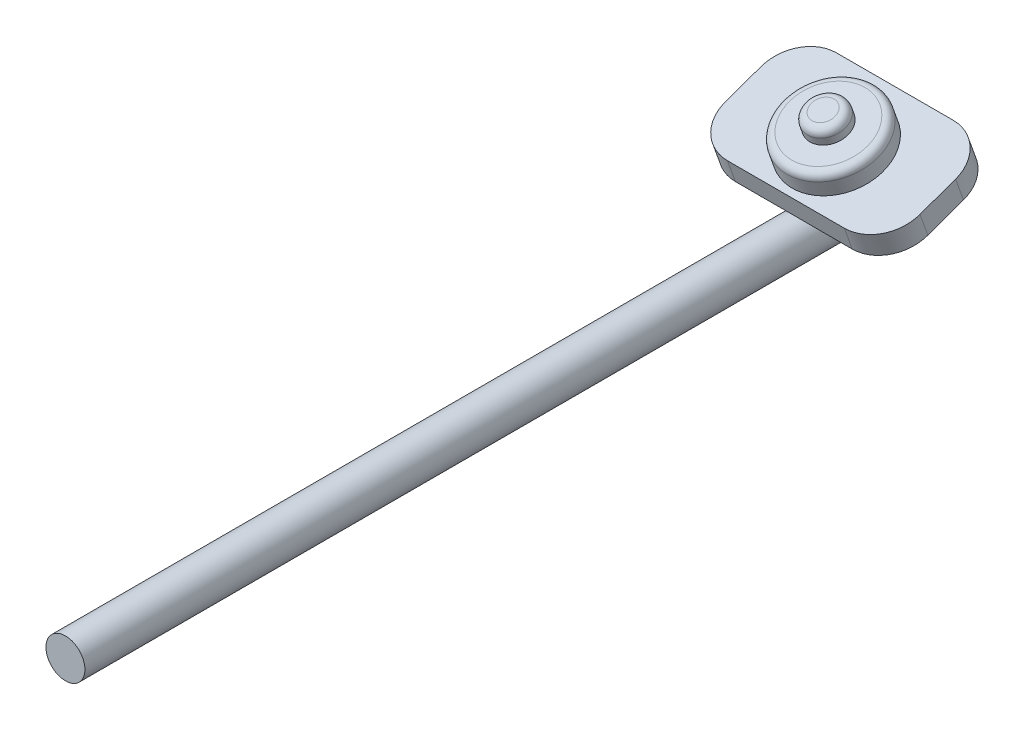
ISO-10303-21;
HEADER;
FILE_DESCRIPTION(('STEP AP214'),'2;1');
FILE_NAME('part.step','',(''),(''),'','','');
FILE_SCHEMA(('AUTOMOTIVE_DESIGN { 1 0 10303 214 1 1 1 1 }'));
ENDSEC;
DATA;
#1=APPLICATION_CONTEXT('core data for automotive mechanical design processes');
#2=APPLICATION_PROTOCOL_DEFINITION('international standard','automotive_design',2000,#1);
#3=PRODUCT_CONTEXT('',#1,'mechanical');
#4=PRODUCT('Part','Part','',(#3));
#5=PRODUCT_RELATED_PRODUCT_CATEGORY('part','',(#4));
#6=PRODUCT_DEFINITION_FORMATION('','',#4);
#7=PRODUCT_DEFINITION_CONTEXT('part definition',#1,'design');
#8=PRODUCT_DEFINITION('design','',#6,#7);
#9=PRODUCT_DEFINITION_SHAPE('','',#8);
#10=(LENGTH_UNIT() NAMED_UNIT(*) SI_UNIT(.MILLI.,.METRE.));
#11=(NAMED_UNIT(*) PLANE_ANGLE_UNIT() SI_UNIT($,.RADIAN.));
#12=(NAMED_UNIT(*) SI_UNIT($,.STERADIAN.) SOLID_ANGLE_UNIT());
#13=UNCERTAINTY_MEASURE_WITH_UNIT(LENGTH_MEASURE(1.E-05),#10,'distance_accuracy_value','');
#14=(GEOMETRIC_REPRESENTATION_CONTEXT(3) GLOBAL_UNCERTAINTY_ASSIGNED_CONTEXT((#13)) GLOBAL_UNIT_ASSIGNED_CONTEXT((#10,
#11,#12)) REPRESENTATION_CONTEXT('',''));
#15=CARTESIAN_POINT('',(0.,0.,0.));
#16=DIRECTION('',(0.,0.,1.));
#17=DIRECTION('',(1.,0.,0.));
#18=AXIS2_PLACEMENT_3D('',#15,#16,#17);
#19=CARTESIAN_POINT('',(0.,0.,100.));
#20=DIRECTION('',(0.,0.,-1.));
#21=DIRECTION('',(-1.,0.,0.));
#22=AXIS2_PLACEMENT_3D('',#19,#20,#21);
#23=CYLINDRICAL_SURFACE('',#22,2.5);
#24=CARTESIAN_POINT('',(0.,0.,100.));
#25=DIRECTION('',(0.,0.,1.));
#26=DIRECTION('',(1.,0.,0.));
#27=AXIS2_PLACEMENT_3D('',#24,#25,#26);
#28=CIRCLE('',#27,2.5);
#29=CARTESIAN_POINT('',(2.5,0.,100.));
#30=VERTEX_POINT('',#29);
#31=EDGE_CURVE('E11',#30,#30,#28,.T.);
#32=ORIENTED_EDGE('',*,*,#31,.F.);
#33=EDGE_LOOP('',(#32));
#34=FACE_BOUND('',#33,.T.);
#35=CARTESIAN_POINT('',(0.,0.,0.));
#36=DIRECTION('',(0.,0.,1.));
#37=DIRECTION('',(1.,0.,0.));
#38=AXIS2_PLACEMENT_3D('',#35,#36,#37);
#39=CIRCLE('',#38,2.5);
#40=CARTESIAN_POINT('',(2.5,0.,0.));
#41=VERTEX_POINT('',#40);
#42=EDGE_CURVE('E61',#41,#41,#39,.T.);
#43=ORIENTED_EDGE('',*,*,#42,.T.);
#44=EDGE_LOOP('',(#43));
#45=FACE_BOUND('',#44,.T.);
#46=ADVANCED_FACE('F53',(#34,#45),#23,.T.);
#47=CARTESIAN_POINT('',(0.,0.,100.));
#48=DIRECTION('',(0.,0.,1.));
#49=DIRECTION('',(1.,0.,0.));
#50=AXIS2_PLACEMENT_3D('',#47,#48,#49);
#51=PLANE('',#50);
#52=ORIENTED_EDGE('',*,*,#31,.T.);
#53=EDGE_LOOP('',(#52));
#54=FACE_BOUND('',#53,.T.);
#55=ADVANCED_FACE('F55',(#54),#51,.T.);
#56=CARTESIAN_POINT('',(0.,0.,0.));
#57=DIRECTION('',(0.,0.,1.));
#58=DIRECTION('',(1.,0.,0.));
#59=AXIS2_PLACEMENT_3D('',#56,#57,#58);
#60=PLANE('',#59);
#61=ORIENTED_EDGE('',*,*,#42,.F.);
#62=EDGE_LOOP('',(#61));
#63=FACE_BOUND('',#62,.T.);
#64=ADVANCED_FACE('F69',(#63),#60,.F.);
#65=CLOSED_SHELL('',(#46,#55,#64));
#66=MANIFOLD_SOLID_BREP('B2',#65);
#67=CARTESIAN_POINT('',(12.5,7.09872421921121,2.53700279345642));
#68=DIRECTION('',(0.,-0.941668605803775,-0.33654158263664));
#69=DIRECTION('',(0.,0.33654158263664,-0.941668605803775));
#70=AXIS2_PLACEMENT_3D('',#67,#68,#69);
#71=PLANE('',#70);
#72=CARTESIAN_POINT('',(0.,7.63267315631821,1.04297359434012));
#73=DIRECTION('',(0.,-0.941668605803775,-0.33654158263664));
#74=DIRECTION('',(0.,0.33654158263664,-0.941668605803775));
#75=AXIS2_PLACEMENT_3D('',#72,#73,#74);
#76=CIRCLE('',#75,6.);
#77=CARTESIAN_POINT('',(0.,9.65192265213805,-4.60703804048253));
#78=VERTEX_POINT('',#77);
#79=EDGE_CURVE('E204',#78,#78,#76,.F.);
#80=ORIENTED_EDGE('',*,*,#79,.F.);
#81=EDGE_LOOP('',(#80));
#82=FACE_BOUND('',#81,.T.);
#83=DIRECTION('',(0.,-0.33654158263664,0.941668605803775));
#84=VECTOR('',#83,1.);
#85=CARTESIAN_POINT('',(12.5,7.09872421921121,2.53700279345642));
#86=LINE('',#85,#84);
#87=CARTESIAN_POINT('',(12.5,8.64229790422812,-1.7820322230712));
#88=VERTEX_POINT('',#87);
#89=CARTESIAN_POINT('',(12.5,7.00771373059453,2.79165697098112));
#90=VERTEX_POINT('',#89);
#91=EDGE_CURVE('E309',#88,#90,#86,.T.);
#92=ORIENTED_EDGE('',*,*,#91,.F.);
#93=CARTESIAN_POINT('',(7.5,8.64229790422812,-1.7820322230712));
#94=DIRECTION('',(0.,-0.941668605803775,-0.33654158263664));
#95=DIRECTION('',(0.,0.33654158263664,-0.941668605803775));
#96=AXIS2_PLACEMENT_3D('',#93,#94,#95);
#97=CIRCLE('',#96,5.);
#98=CARTESIAN_POINT('',(7.5,10.3250058174113,-6.49037525209008));
#99=VERTEX_POINT('',#98);
#100=EDGE_CURVE('E199',#88,#99,#97,.F.);
#101=ORIENTED_EDGE('',*,*,#100,.T.);
#102=DIRECTION('',(-1.,0.,0.));
#103=VECTOR('',#102,1.);
#104=CARTESIAN_POINT('',(12.5,10.3250058174113,-6.49037525209008));
#105=LINE('',#104,#103);
#106=CARTESIAN_POINT('',(-7.5,10.3250058174113,-6.49037525209008));
#107=VERTEX_POINT('',#106);
#108=EDGE_CURVE('E295',#99,#107,#105,.T.);
#109=ORIENTED_EDGE('',*,*,#108,.T.);
#110=CARTESIAN_POINT('',(-7.5,8.64229790422812,-1.7820322230712));
#111=DIRECTION('',(0.,-0.941668605803775,-0.33654158263664));
#112=DIRECTION('',(0.,0.33654158263664,-0.941668605803775));
#113=AXIS2_PLACEMENT_3D('',#110,#111,#112);
#114=CIRCLE('',#113,5.);
#115=CARTESIAN_POINT('',(-12.5,8.64229790422812,-1.78203222307121));
#116=VERTEX_POINT('',#115);
#117=EDGE_CURVE('E202',#107,#116,#114,.F.);
#118=ORIENTED_EDGE('',*,*,#117,.T.);
#119=DIRECTION('',(0.,-0.33654158263664,0.941668605803775));
#120=VECTOR('',#119,1.);
#121=CARTESIAN_POINT('',(-12.5,7.09872421921121,2.53700279345642));
#122=LINE('',#121,#120);
#123=CARTESIAN_POINT('',(-12.5,7.00771373059453,2.79165697098112));
#124=VERTEX_POINT('',#123);
#125=EDGE_CURVE('E195',#116,#124,#122,.T.);
#126=ORIENTED_EDGE('',*,*,#125,.T.);
#127=CARTESIAN_POINT('',(-7.5,7.00771373059453,2.79165697098112));
#128=DIRECTION('',(0.,-0.941668605803775,-0.33654158263664));
#129=DIRECTION('',(0.,0.33654158263664,-0.941668605803775));
#130=AXIS2_PLACEMENT_3D('',#127,#128,#129);
#131=CIRCLE('',#130,5.);
#132=CARTESIAN_POINT('',(-7.5,5.32500581741133,7.5));
#133=VERTEX_POINT('',#132);
#134=EDGE_CURVE('E200',#124,#133,#131,.F.);
#135=ORIENTED_EDGE('',*,*,#134,.T.);
#136=DIRECTION('',(-1.,0.,0.));
#137=VECTOR('',#136,1.);
#138=CARTESIAN_POINT('',(12.5,5.32500581741133,7.5));
#139=LINE('',#138,#137);
#140=CARTESIAN_POINT('',(7.5,5.32500581741133,7.5));
#141=VERTEX_POINT('',#140);
#142=EDGE_CURVE('E290',#141,#133,#139,.T.);
#143=ORIENTED_EDGE('',*,*,#142,.F.);
#144=CARTESIAN_POINT('',(7.5,7.00771373059452,2.79165697098112));
#145=DIRECTION('',(0.,-0.941668605803775,-0.33654158263664));
#146=DIRECTION('',(0.,0.33654158263664,-0.941668605803775));
#147=AXIS2_PLACEMENT_3D('',#144,#145,#146);
#148=CIRCLE('',#147,5.);
#149=EDGE_CURVE('E209',#141,#90,#148,.F.);
#150=ORIENTED_EDGE('',*,*,#149,.T.);
#151=EDGE_LOOP('',(#92,#101,#109,#118,#126,#135,#143,#150));
#152=FACE_BOUND('',#151,.T.);
#153=ADVANCED_FACE('F108',(#82,#152),#71,.F.);
#154=CARTESIAN_POINT('',(12.5,-1.77371840179989,4.96299720654358));
#155=DIRECTION('',(0.,0.33654158263664,-0.941668605803775));
#156=DIRECTION('',(0.,0.941668605803775,0.33654158263664));
#157=AXIS2_PLACEMENT_3D('',#154,#155,#156);
#158=PLANE('',#157);
#159=DIRECTION('',(-1.,0.,0.));
#160=VECTOR('',#159,1.);
#161=CARTESIAN_POINT('',(12.5,2.5,6.49037525209007));
#162=LINE('',#161,#160);
#163=CARTESIAN_POINT('',(7.5,2.5,6.49037525209007));
#164=VERTEX_POINT('',#163);
#165=CARTESIAN_POINT('',(-7.5,2.5,6.49037525209007));
#166=VERTEX_POINT('',#165);
#167=EDGE_CURVE('E294',#164,#166,#162,.T.);
#168=ORIENTED_EDGE('',*,*,#167,.F.);
#169=DIRECTION('',(0.,-0.941668605803775,-0.33654158263664));
#170=VECTOR('',#169,1.);
#171=CARTESIAN_POINT('',(7.5,-1.77371840179989,4.96299720654358));
#172=LINE('',#171,#170);
#173=EDGE_CURVE('E223',#164,#141,#172,.F.);
#174=ORIENTED_EDGE('',*,*,#173,.T.);
#175=ORIENTED_EDGE('',*,*,#142,.T.);
#176=DIRECTION('',(0.,-0.941668605803775,-0.33654158263664));
#177=VECTOR('',#176,1.);
#178=CARTESIAN_POINT('',(-7.5,-1.77371840179989,4.96299720654358));
#179=LINE('',#178,#177);
#180=EDGE_CURVE('E183',#133,#166,#179,.T.);
#181=ORIENTED_EDGE('',*,*,#180,.T.);
#182=EDGE_LOOP('',(#168,#174,#175,#181));
#183=FACE_BOUND('',#182,.T.);
#184=ADVANCED_FACE('F248',(#183),#158,.F.);
#185=CARTESIAN_POINT('',(12.5,3.22628159820011,-9.0273780455465));
#186=DIRECTION('',(0.,-0.33654158263664,0.941668605803775));
#187=DIRECTION('',(0.,-0.941668605803775,-0.33654158263664));
#188=AXIS2_PLACEMENT_3D('',#185,#186,#187);
#189=PLANE('',#188);
#190=ORIENTED_EDGE('',*,*,#108,.F.);
#191=DIRECTION('',(0.,0.941668605803775,0.33654158263664));
#192=VECTOR('',#191,1.);
#193=CARTESIAN_POINT('',(7.5,3.22628159820011,-9.0273780455465));
#194=LINE('',#193,#192);
#195=CARTESIAN_POINT('',(7.5,7.5,-7.5));
#196=VERTEX_POINT('',#195);
#197=EDGE_CURVE('E215',#99,#196,#194,.F.);
#198=ORIENTED_EDGE('',*,*,#197,.T.);
#199=DIRECTION('',(-1.,0.,0.));
#200=VECTOR('',#199,1.);
#201=CARTESIAN_POINT('',(12.5,7.5,-7.5));
#202=LINE('',#201,#200);
#203=CARTESIAN_POINT('',(-7.5,7.5,-7.5));
#204=VERTEX_POINT('',#203);
#205=EDGE_CURVE('E179',#196,#204,#202,.T.);
#206=ORIENTED_EDGE('',*,*,#205,.T.);
#207=DIRECTION('',(0.,0.941668605803775,0.33654158263664));
#208=VECTOR('',#207,1.);
#209=CARTESIAN_POINT('',(-7.5,3.22628159820011,-9.0273780455465));
#210=LINE('',#209,#208);
#211=EDGE_CURVE('E212',#204,#107,#210,.T.);
#212=ORIENTED_EDGE('',*,*,#211,.T.);
#213=EDGE_LOOP('',(#190,#198,#206,#212));
#214=FACE_BOUND('',#213,.T.);
#215=ADVANCED_FACE('F254',(#214),#189,.F.);
#216=CARTESIAN_POINT('',(12.5,15.,7.5));
#217=DIRECTION('',(-1.,0.,0.));
#218=DIRECTION('',(0.,0.,1.));
#219=AXIS2_PLACEMENT_3D('',#216,#217,#218);
#220=PLANE('',#219);
#221=DIRECTION('',(0.,-0.33654158263664,0.941668605803775));
#222=VECTOR('',#221,1.);
#223=CARTESIAN_POINT('',(12.5,4.27371840179989,1.5273780455465));
#224=LINE('',#223,#222);
#225=CARTESIAN_POINT('',(12.5,5.8172920868168,-2.79165697098112));
#226=VERTEX_POINT('',#225);
#227=CARTESIAN_POINT('',(12.5,4.1827079131832,1.7820322230712));
#228=VERTEX_POINT('',#227);
#229=EDGE_CURVE('E177',#226,#228,#224,.T.);
#230=ORIENTED_EDGE('',*,*,#229,.F.);
#231=DIRECTION('',(0.,0.941668605803775,0.33654158263664));
#232=VECTOR('',#231,1.);
#233=CARTESIAN_POINT('',(12.5,17.2214999542366,1.2840764035458));
#234=LINE('',#233,#232);
#235=EDGE_CURVE('E191',#226,#88,#234,.T.);
#236=ORIENTED_EDGE('',*,*,#235,.T.);
#237=ORIENTED_EDGE('',*,*,#91,.T.);
#238=DIRECTION('',(0.,-0.941668605803775,-0.33654158263664));
#239=VECTOR('',#238,1.);
#240=CARTESIAN_POINT('',(12.5,15.586915780603,5.85776559759812));
#241=LINE('',#240,#239);
#242=EDGE_CURVE('E194',#90,#228,#241,.T.);
#243=ORIENTED_EDGE('',*,*,#242,.T.);
#244=EDGE_LOOP('',(#230,#236,#237,#243));
#245=FACE_BOUND('',#244,.T.);
#246=ADVANCED_FACE('F189',(#245),#220,.F.);
#247=CARTESIAN_POINT('',(-12.5,15.,7.5));
#248=DIRECTION('',(1.,0.,0.));
#249=DIRECTION('',(0.,0.,-1.));
#250=AXIS2_PLACEMENT_3D('',#247,#248,#249);
#251=PLANE('',#250);
#252=ORIENTED_EDGE('',*,*,#125,.F.);
#253=DIRECTION('',(0.,0.941668605803775,0.33654158263664));
#254=VECTOR('',#253,1.);
#255=CARTESIAN_POINT('',(-12.5,17.2214999542366,1.2840764035458));
#256=LINE('',#255,#254);
#257=CARTESIAN_POINT('',(-12.5,5.8172920868168,-2.79165697098112));
#258=VERTEX_POINT('',#257);
#259=EDGE_CURVE('E130',#116,#258,#256,.F.);
#260=ORIENTED_EDGE('',*,*,#259,.T.);
#261=DIRECTION('',(0.,-0.33654158263664,0.941668605803775));
#262=VECTOR('',#261,1.);
#263=CARTESIAN_POINT('',(-12.5,4.27371840179989,1.5273780455465));
#264=LINE('',#263,#262);
#265=CARTESIAN_POINT('',(-12.5,4.1827079131832,1.7820322230712));
#266=VERTEX_POINT('',#265);
#267=EDGE_CURVE('E196',#258,#266,#264,.T.);
#268=ORIENTED_EDGE('',*,*,#267,.T.);
#269=DIRECTION('',(0.,-0.941668605803775,-0.33654158263664));
#270=VECTOR('',#269,1.);
#271=CARTESIAN_POINT('',(-12.5,15.586915780603,5.85776559759812));
#272=LINE('',#271,#270);
#273=EDGE_CURVE('E225',#266,#124,#272,.F.);
#274=ORIENTED_EDGE('',*,*,#273,.T.);
#275=EDGE_LOOP('',(#252,#260,#268,#274));
#276=FACE_BOUND('',#275,.T.);
#277=ADVANCED_FACE('F267',(#276),#251,.F.);
#278=CARTESIAN_POINT('',(12.5,4.27371840179989,1.5273780455465));
#279=DIRECTION('',(0.,-0.941668605803775,-0.33654158263664));
#280=DIRECTION('',(0.,0.33654158263664,-0.941668605803775));
#281=AXIS2_PLACEMENT_3D('',#278,#279,#280);
#282=PLANE('',#281);
#283=ORIENTED_EDGE('',*,*,#205,.F.);
#284=CARTESIAN_POINT('',(7.5,5.8172920868168,-2.79165697098112));
#285=DIRECTION('',(0.,-0.941668605803775,-0.33654158263664));
#286=DIRECTION('',(0.,0.33654158263664,-0.941668605803775));
#287=AXIS2_PLACEMENT_3D('',#284,#285,#286);
#288=CIRCLE('',#287,5.);
#289=EDGE_CURVE('E174',#196,#226,#288,.T.);
#290=ORIENTED_EDGE('',*,*,#289,.T.);
#291=ORIENTED_EDGE('',*,*,#229,.T.);
#292=CARTESIAN_POINT('',(7.5,4.1827079131832,1.7820322230712));
#293=DIRECTION('',(0.,-0.941668605803775,-0.33654158263664));
#294=DIRECTION('',(0.,0.33654158263664,-0.941668605803775));
#295=AXIS2_PLACEMENT_3D('',#292,#293,#294);
#296=CIRCLE('',#295,5.);
#297=EDGE_CURVE('E184',#228,#164,#296,.T.);
#298=ORIENTED_EDGE('',*,*,#297,.T.);
#299=ORIENTED_EDGE('',*,*,#167,.T.);
#300=CARTESIAN_POINT('',(-7.5,4.1827079131832,1.7820322230712));
#301=DIRECTION('',(0.,-0.941668605803775,-0.33654158263664));
#302=DIRECTION('',(0.,0.33654158263664,-0.941668605803775));
#303=AXIS2_PLACEMENT_3D('',#300,#301,#302);
#304=CIRCLE('',#303,5.);
#305=EDGE_CURVE('E123',#166,#266,#304,.T.);
#306=ORIENTED_EDGE('',*,*,#305,.T.);
#307=ORIENTED_EDGE('',*,*,#267,.F.);
#308=CARTESIAN_POINT('',(-7.5,5.8172920868168,-2.79165697098112));
#309=DIRECTION('',(0.,-0.941668605803775,-0.33654158263664));
#310=DIRECTION('',(0.,0.33654158263664,-0.941668605803775));
#311=AXIS2_PLACEMENT_3D('',#308,#309,#310);
#312=CIRCLE('',#311,5.);
#313=EDGE_CURVE('E218',#258,#204,#312,.T.);
#314=ORIENTED_EDGE('',*,*,#313,.T.);
#315=EDGE_LOOP('',(#283,#290,#291,#298,#299,#306,#307,#314));
#316=FACE_BOUND('',#315,.T.);
#317=ADVANCED_FACE('F176',(#316),#282,.T.);
#318=CARTESIAN_POINT('',(0.,10.4576789737295,2.05259834225004));
#319=DIRECTION('',(0.,-0.941668605803775,-0.33654158263664));
#320=DIRECTION('',(0.,0.33654158263664,-0.941668605803775));
#321=AXIS2_PLACEMENT_3D('',#318,#319,#320);
#322=CYLINDRICAL_SURFACE('',#321,6.);
#323=CARTESIAN_POINT('',(0.,9.51601036792576,1.7160567596134));
#324=DIRECTION('',(0.,0.941668605803775,0.33654158263664));
#325=DIRECTION('',(0.,-0.33654158263664,0.941668605803775));
#326=AXIS2_PLACEMENT_3D('',#323,#324,#325);
#327=CIRCLE('',#326,6.);
#328=CARTESIAN_POINT('',(0.,7.49676087210592,7.36606839443605));
#329=VERTEX_POINT('',#328);
#330=EDGE_CURVE('E231',#329,#329,#327,.F.);
#331=ORIENTED_EDGE('',*,*,#330,.T.);
#332=EDGE_LOOP('',(#331));
#333=FACE_BOUND('',#332,.T.);
#334=ORIENTED_EDGE('',*,*,#79,.T.);
#335=EDGE_LOOP('',(#334));
#336=FACE_BOUND('',#335,.T.);
#337=ADVANCED_FACE('F325',(#333,#336),#322,.T.);
#338=CARTESIAN_POINT('',(0.,9.92373003662254,3.54662754136634));
#339=DIRECTION('',(0.,0.941668605803775,0.33654158263664));
#340=DIRECTION('',(0.,-0.33654158263664,0.941668605803775));
#341=AXIS2_PLACEMENT_3D('',#338,#339,#340);
#342=PLANE('',#341);
#343=CARTESIAN_POINT('',(0.,10.4576789737295,2.05259834225004));
#344=DIRECTION('',(0.,0.941668605803775,0.33654158263664));
#345=DIRECTION('',(0.,-0.33654158263664,0.941668605803775));
#346=AXIS2_PLACEMENT_3D('',#343,#344,#345);
#347=CIRCLE('',#346,5.);
#348=CARTESIAN_POINT('',(0.,8.77497106054634,6.76094137126892));
#349=VERTEX_POINT('',#348);
#350=EDGE_CURVE('E228',#349,#349,#347,.T.);
#351=ORIENTED_EDGE('',*,*,#350,.T.);
#352=EDGE_LOOP('',(#351));
#353=FACE_BOUND('',#352,.T.);
#354=CARTESIAN_POINT('',(0.,10.4576789737295,2.05259834225004));
#355=DIRECTION('',(0.,0.941668605803775,0.33654158263664));
#356=DIRECTION('',(0.,-0.33654158263664,0.941668605803775));
#357=AXIS2_PLACEMENT_3D('',#354,#355,#356);
#358=CIRCLE('',#357,2.5);
#359=CARTESIAN_POINT('',(0.,9.61632501713794,4.40676985675948));
#360=VERTEX_POINT('',#359);
#361=EDGE_CURVE('E303',#360,#360,#358,.F.);
#362=ORIENTED_EDGE('',*,*,#361,.T.);
#363=EDGE_LOOP('',(#362));
#364=FACE_BOUND('',#363,.T.);
#365=ADVANCED_FACE('F314',(#353,#364),#342,.T.);
#366=CARTESIAN_POINT('',(0.,12.3410161853371,2.72568150752332));
#367=DIRECTION('',(0.,-0.941668605803775,-0.33654158263664));
#368=DIRECTION('',(0.,0.33654158263664,-0.941668605803775));
#369=AXIS2_PLACEMENT_3D('',#366,#367,#368);
#370=CYLINDRICAL_SURFACE('',#369,2.5);
#371=CARTESIAN_POINT('',(0.,11.3993475795333,2.38913992488668));
#372=DIRECTION('',(0.,0.941668605803775,0.33654158263664));
#373=DIRECTION('',(0.,-0.33654158263664,0.941668605803775));
#374=AXIS2_PLACEMENT_3D('',#371,#372,#373);
#375=CIRCLE('',#374,2.5);
#376=CARTESIAN_POINT('',(0.,10.5579936229417,4.74331143939612));
#377=VERTEX_POINT('',#376);
#378=EDGE_CURVE('E51',#377,#377,#375,.F.);
#379=ORIENTED_EDGE('',*,*,#378,.T.);
#380=EDGE_LOOP('',(#379));
#381=FACE_BOUND('',#380,.T.);
#382=ORIENTED_EDGE('',*,*,#361,.F.);
#383=EDGE_LOOP('',(#382));
#384=FACE_BOUND('',#383,.T.);
#385=ADVANCED_FACE('F316',(#381,#384),#370,.T.);
#386=CARTESIAN_POINT('',(0.,11.8070672482301,4.21971070663962));
#387=DIRECTION('',(0.,0.941668605803775,0.33654158263664));
#388=DIRECTION('',(0.,-0.33654158263664,0.941668605803775));
#389=AXIS2_PLACEMENT_3D('',#386,#387,#388);
#390=PLANE('',#389);
#391=CARTESIAN_POINT('',(0.,12.3410161853371,2.72568150752332));
#392=DIRECTION('',(0.,0.941668605803775,0.33654158263664));
#393=DIRECTION('',(0.,-0.33654158263664,0.941668605803775));
#394=AXIS2_PLACEMENT_3D('',#391,#392,#393);
#395=CIRCLE('',#394,1.5);
#396=CARTESIAN_POINT('',(0.,11.8362038113821,4.13818441622898));
#397=VERTEX_POINT('',#396);
#398=EDGE_CURVE('E116',#397,#397,#395,.T.);
#399=ORIENTED_EDGE('',*,*,#398,.T.);
#400=EDGE_LOOP('',(#399));
#401=FACE_BOUND('',#400,.T.);
#402=ADVANCED_FACE('F236',(#401),#390,.T.);
#403=CARTESIAN_POINT('',(7.5,17.2214999542366,1.2840764035458));
#404=DIRECTION('',(0.,0.941668605803775,0.33654158263664));
#405=DIRECTION('',(0.,-0.33654158263664,0.941668605803775));
#406=AXIS2_PLACEMENT_3D('',#403,#404,#405);
#407=CYLINDRICAL_SURFACE('',#406,5.);
#408=ORIENTED_EDGE('',*,*,#289,.F.);
#409=ORIENTED_EDGE('',*,*,#197,.F.);
#410=ORIENTED_EDGE('',*,*,#100,.F.);
#411=ORIENTED_EDGE('',*,*,#235,.F.);
#412=EDGE_LOOP('',(#408,#409,#410,#411));
#413=FACE_BOUND('',#412,.T.);
#414=ADVANCED_FACE('F198',(#413),#407,.T.);
#415=CARTESIAN_POINT('',(7.5,15.586915780603,5.85776559759812));
#416=DIRECTION('',(0.,-0.941668605803775,-0.33654158263664));
#417=DIRECTION('',(0.,0.33654158263664,-0.941668605803775));
#418=AXIS2_PLACEMENT_3D('',#415,#416,#417);
#419=CYLINDRICAL_SURFACE('',#418,5.);
#420=ORIENTED_EDGE('',*,*,#149,.F.);
#421=ORIENTED_EDGE('',*,*,#173,.F.);
#422=ORIENTED_EDGE('',*,*,#297,.F.);
#423=ORIENTED_EDGE('',*,*,#242,.F.);
#424=EDGE_LOOP('',(#420,#421,#422,#423));
#425=FACE_BOUND('',#424,.T.);
#426=ADVANCED_FACE('F272',(#425),#419,.T.);
#427=CARTESIAN_POINT('',(-7.5,1.54357368501691,-4.31903501652762));
#428=DIRECTION('',(0.,0.941668605803775,0.33654158263664));
#429=DIRECTION('',(0.,-0.33654158263664,0.941668605803775));
#430=AXIS2_PLACEMENT_3D('',#427,#428,#429);
#431=CYLINDRICAL_SURFACE('',#430,5.);
#432=ORIENTED_EDGE('',*,*,#313,.F.);
#433=ORIENTED_EDGE('',*,*,#259,.F.);
#434=ORIENTED_EDGE('',*,*,#117,.F.);
#435=ORIENTED_EDGE('',*,*,#211,.F.);
#436=EDGE_LOOP('',(#432,#433,#434,#435));
#437=FACE_BOUND('',#436,.T.);
#438=ADVANCED_FACE('F275',(#437),#431,.T.);
#439=CARTESIAN_POINT('',(-7.5,-0.091010488616686,0.254654177524702));
#440=DIRECTION('',(0.,-0.941668605803775,-0.33654158263664));
#441=DIRECTION('',(0.,0.33654158263664,-0.941668605803775));
#442=AXIS2_PLACEMENT_3D('',#439,#440,#441);
#443=CYLINDRICAL_SURFACE('',#442,5.);
#444=ORIENTED_EDGE('',*,*,#134,.F.);
#445=ORIENTED_EDGE('',*,*,#273,.F.);
#446=ORIENTED_EDGE('',*,*,#305,.F.);
#447=ORIENTED_EDGE('',*,*,#180,.F.);
#448=EDGE_LOOP('',(#444,#445,#446,#447));
#449=FACE_BOUND('',#448,.T.);
#450=ADVANCED_FACE('F244',(#449),#443,.T.);
#451=CARTESIAN_POINT('',(0.,9.51601036792576,1.7160567596134));
#452=DIRECTION('',(0.,0.941668605803775,0.33654158263664));
#453=DIRECTION('',(0.,-0.33654158263664,0.941668605803775));
#454=AXIS2_PLACEMENT_3D('',#451,#452,#453);
#455=TOROIDAL_SURFACE('',#454,5.,1.);
#456=ORIENTED_EDGE('',*,*,#330,.F.);
#457=EDGE_LOOP('',(#456));
#458=FACE_BOUND('',#457,.T.);
#459=ORIENTED_EDGE('',*,*,#350,.F.);
#460=EDGE_LOOP('',(#459));
#461=FACE_BOUND('',#460,.T.);
#462=ADVANCED_FACE('F239',(#458,#461),#455,.T.);
#463=CARTESIAN_POINT('',(0.,11.3993475795333,2.38913992488668));
#464=DIRECTION('',(0.,0.941668605803775,0.33654158263664));
#465=DIRECTION('',(0.,-0.33654158263664,0.941668605803775));
#466=AXIS2_PLACEMENT_3D('',#463,#464,#465);
#467=TOROIDAL_SURFACE('',#466,1.5,1.);
#468=ORIENTED_EDGE('',*,*,#378,.F.);
#469=EDGE_LOOP('',(#468));
#470=FACE_BOUND('',#469,.T.);
#471=ORIENTED_EDGE('',*,*,#398,.F.);
#472=EDGE_LOOP('',(#471));
#473=FACE_BOUND('',#472,.T.);
#474=ADVANCED_FACE('F110',(#470,#473),#467,.T.);
#475=CLOSED_SHELL('',(#153,#184,#215,#246,#277,#317,#337,#365,#385,#402,#414,#426,#438,#450,
#462,#474));
#476=MANIFOLD_SOLID_BREP('B6',#475);
#477=ADVANCED_BREP_SHAPE_REPRESENTATION('',(#18,#66,#476),#14);
#478=SHAPE_DEFINITION_REPRESENTATION(#9,#477);
ENDSEC;
END-ISO-10303-21;
